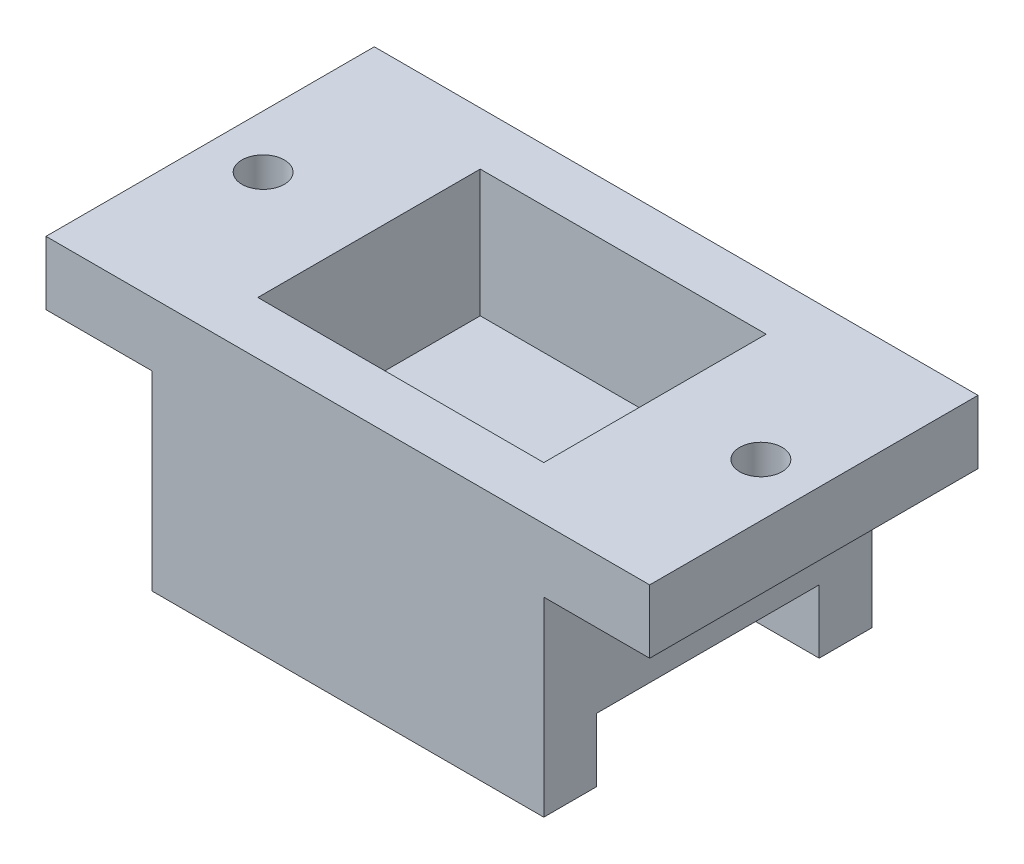
ISO-10303-21;
HEADER;
FILE_DESCRIPTION(('STEP AP214'),'2;1');
FILE_NAME('part.step','',(''),(''),'','','');
FILE_SCHEMA(('AUTOMOTIVE_DESIGN { 1 0 10303 214 1 1 1 1 }'));
ENDSEC;
DATA;
#1=APPLICATION_CONTEXT('core data for automotive mechanical design processes');
#2=APPLICATION_PROTOCOL_DEFINITION('international standard','automotive_design',2000,#1);
#3=PRODUCT_CONTEXT('',#1,'mechanical');
#4=PRODUCT('Part','Part','',(#3));
#5=PRODUCT_RELATED_PRODUCT_CATEGORY('part','',(#4));
#6=PRODUCT_DEFINITION_FORMATION('','',#4);
#7=PRODUCT_DEFINITION_CONTEXT('part definition',#1,'design');
#8=PRODUCT_DEFINITION('design','',#6,#7);
#9=PRODUCT_DEFINITION_SHAPE('','',#8);
#10=(LENGTH_UNIT() NAMED_UNIT(*) SI_UNIT(.MILLI.,.METRE.));
#11=(NAMED_UNIT(*) PLANE_ANGLE_UNIT() SI_UNIT($,.RADIAN.));
#12=(NAMED_UNIT(*) SI_UNIT($,.STERADIAN.) SOLID_ANGLE_UNIT());
#13=UNCERTAINTY_MEASURE_WITH_UNIT(LENGTH_MEASURE(1.E-05),#10,'distance_accuracy_value','');
#14=(GEOMETRIC_REPRESENTATION_CONTEXT(3) GLOBAL_UNCERTAINTY_ASSIGNED_CONTEXT((#13)) GLOBAL_UNIT_ASSIGNED_CONTEXT((#10,
#11,#12)) REPRESENTATION_CONTEXT('',''));
#15=CARTESIAN_POINT('',(0.,0.,0.));
#16=DIRECTION('',(0.,0.,1.));
#17=DIRECTION('',(1.,0.,0.));
#18=AXIS2_PLACEMENT_3D('',#15,#16,#17);
#19=CARTESIAN_POINT('',(-12.8729166666667,11.,-6.78333333333334));
#20=DIRECTION('',(1.,0.,0.));
#21=DIRECTION('',(0.,0.,-1.));
#22=AXIS2_PLACEMENT_3D('',#19,#20,#21);
#23=PLANE('',#22);
#24=DIRECTION('',(0.,0.,1.));
#25=VECTOR('',#24,1.);
#26=CARTESIAN_POINT('',(-12.8729166666667,11.,-6.78333333333334));
#27=LINE('',#26,#25);
#28=CARTESIAN_POINT('',(-12.8729166666667,11.,-6.78333333333334));
#29=VERTEX_POINT('',#28);
#30=CARTESIAN_POINT('',(-12.8729166666667,11.,8.71666666666666));
#31=VERTEX_POINT('',#30);
#32=EDGE_CURVE('E56',#29,#31,#27,.T.);
#33=ORIENTED_EDGE('',*,*,#32,.F.);
#34=DIRECTION('',(0.,-1.,0.));
#35=VECTOR('',#34,1.);
#36=CARTESIAN_POINT('',(-12.8729166666667,11.,-6.78333333333334));
#37=LINE('',#36,#35);
#38=CARTESIAN_POINT('',(-12.8729166666667,2.,-6.78333333333334));
#39=VERTEX_POINT('',#38);
#40=EDGE_CURVE('E48',#29,#39,#37,.T.);
#41=ORIENTED_EDGE('',*,*,#40,.T.);
#42=DIRECTION('',(0.,0.,-1.));
#43=VECTOR('',#42,1.);
#44=CARTESIAN_POINT('',(-12.8729166666667,2.,0.));
#45=LINE('',#44,#43);
#46=CARTESIAN_POINT('',(-12.8729166666667,2.,-4.28456473604802));
#47=VERTEX_POINT('',#46);
#48=EDGE_CURVE('E207',#47,#39,#45,.T.);
#49=ORIENTED_EDGE('',*,*,#48,.F.);
#50=DIRECTION('',(0.,1.,0.));
#51=VECTOR('',#50,1.);
#52=CARTESIAN_POINT('',(-12.8729166666667,2.,-4.28456473604802));
#53=LINE('',#52,#51);
#54=CARTESIAN_POINT('',(-12.8729166666667,5.,-4.28456473604802));
#55=VERTEX_POINT('',#54);
#56=EDGE_CURVE('E212',#47,#55,#53,.T.);
#57=ORIENTED_EDGE('',*,*,#56,.T.);
#58=DIRECTION('',(0.,0.,1.));
#59=VECTOR('',#58,1.);
#60=CARTESIAN_POINT('',(-12.8729166666667,5.,-17.2833333333333));
#61=LINE('',#60,#59);
#62=CARTESIAN_POINT('',(-12.8729166666667,5.,-4.28333333333334));
#63=VERTEX_POINT('',#62);
#64=EDGE_CURVE('E272',#55,#63,#61,.T.);
#65=ORIENTED_EDGE('',*,*,#64,.T.);
#66=DIRECTION('',(0.,1.,0.));
#67=VECTOR('',#66,1.);
#68=CARTESIAN_POINT('',(-12.8729166666667,2.,-4.28333333333334));
#69=LINE('',#68,#67);
#70=CARTESIAN_POINT('',(-12.8729166666667,2.,-4.28333333333334));
#71=VERTEX_POINT('',#70);
#72=EDGE_CURVE('E245',#71,#63,#69,.T.);
#73=ORIENTED_EDGE('',*,*,#72,.F.);
#74=DIRECTION('',(0.,0.,-1.));
#75=VECTOR('',#74,1.);
#76=CARTESIAN_POINT('',(-12.8729166666667,2.,0.));
#77=LINE('',#76,#75);
#78=CARTESIAN_POINT('',(-12.8729166666667,2.,8.71666666666666));
#79=VERTEX_POINT('',#78);
#80=EDGE_CURVE('E228',#79,#71,#77,.T.);
#81=ORIENTED_EDGE('',*,*,#80,.F.);
#82=DIRECTION('',(0.,-1.,0.));
#83=VECTOR('',#82,1.);
#84=CARTESIAN_POINT('',(-12.8729166666667,11.,8.71666666666666));
#85=LINE('',#84,#83);
#86=EDGE_CURVE('E325',#31,#79,#85,.T.);
#87=ORIENTED_EDGE('',*,*,#86,.F.);
#88=EDGE_LOOP('',(#33,#41,#49,#57,#65,#73,#81,#87));
#89=FACE_BOUND('',#88,.T.);
#90=ADVANCED_FACE('F39',(#89),#23,.F.);
#91=CARTESIAN_POINT('',(-12.8729166666667,5.,-17.2833333333333));
#92=DIRECTION('',(0.,1.,0.));
#93=DIRECTION('',(0.,0.,1.));
#94=AXIS2_PLACEMENT_3D('',#91,#92,#93);
#95=PLANE('',#94);
#96=DIRECTION('',(-1.,0.,0.));
#97=VECTOR('',#96,1.);
#98=CARTESIAN_POINT('',(0.,5.,-4.28456473604802));
#99=LINE('',#98,#97);
#100=CARTESIAN_POINT('',(5.62708333333332,5.,-4.28456473604802));
#101=VERTEX_POINT('',#100);
#102=EDGE_CURVE('E196',#101,#55,#99,.T.);
#103=ORIENTED_EDGE('',*,*,#102,.F.);
#104=DIRECTION('',(0.,0.,1.));
#105=VECTOR('',#104,1.);
#106=CARTESIAN_POINT('',(5.62708333333332,5.,-17.2833333333333));
#107=LINE('',#106,#105);
#108=CARTESIAN_POINT('',(5.62708333333332,5.,6.2178980693814));
#109=VERTEX_POINT('',#108);
#110=EDGE_CURVE('E271',#101,#109,#107,.T.);
#111=ORIENTED_EDGE('',*,*,#110,.T.);
#112=DIRECTION('',(-1.,0.,0.));
#113=VECTOR('',#112,1.);
#114=CARTESIAN_POINT('',(0.,5.,6.2178980693814));
#115=LINE('',#114,#113);
#116=CARTESIAN_POINT('',(0.12708333333332,5.,6.2178980693814));
#117=VERTEX_POINT('',#116);
#118=EDGE_CURVE('E64',#109,#117,#115,.T.);
#119=ORIENTED_EDGE('',*,*,#118,.T.);
#120=DIRECTION('',(0.,0.,-1.));
#121=VECTOR('',#120,1.);
#122=CARTESIAN_POINT('',(0.12708333333332,5.,0.));
#123=LINE('',#122,#121);
#124=CARTESIAN_POINT('',(0.127083333333323,5.,6.21666666666666));
#125=VERTEX_POINT('',#124);
#126=EDGE_CURVE('E222',#117,#125,#123,.T.);
#127=ORIENTED_EDGE('',*,*,#126,.T.);
#128=DIRECTION('',(-1.,0.,0.));
#129=VECTOR('',#128,1.);
#130=CARTESIAN_POINT('',(-10.3729166666667,5.,6.21666666666666));
#131=LINE('',#130,#129);
#132=CARTESIAN_POINT('',(3.12708333333332,5.,6.21666666666666));
#133=VERTEX_POINT('',#132);
#134=EDGE_CURVE('E274',#133,#125,#131,.T.);
#135=ORIENTED_EDGE('',*,*,#134,.F.);
#136=DIRECTION('',(0.,0.,1.));
#137=VECTOR('',#136,1.);
#138=CARTESIAN_POINT('',(3.12708333333332,5.,-4.28333333333334));
#139=LINE('',#138,#137);
#140=CARTESIAN_POINT('',(3.12708333333332,5.,-4.28333333333334));
#141=VERTEX_POINT('',#140);
#142=EDGE_CURVE('E278',#141,#133,#139,.T.);
#143=ORIENTED_EDGE('',*,*,#142,.F.);
#144=DIRECTION('',(1.,0.,0.));
#145=VECTOR('',#144,1.);
#146=CARTESIAN_POINT('',(-10.3729166666667,5.,-4.28333333333334));
#147=LINE('',#146,#145);
#148=CARTESIAN_POINT('',(0.127083333333319,5.,-4.28333333333334));
#149=VERTEX_POINT('',#148);
#150=EDGE_CURVE('E281',#149,#141,#147,.T.);
#151=ORIENTED_EDGE('',*,*,#150,.F.);
#152=DIRECTION('',(1.,0.,0.));
#153=VECTOR('',#152,1.);
#154=CARTESIAN_POINT('',(0.,5.,-4.28333333333334));
#155=LINE('',#154,#153);
#156=EDGE_CURVE('E237',#63,#149,#155,.T.);
#157=ORIENTED_EDGE('',*,*,#156,.F.);
#158=ORIENTED_EDGE('',*,*,#64,.F.);
#159=EDGE_LOOP('',(#103,#111,#119,#127,#135,#143,#151,#157,#158));
#160=FACE_BOUND('',#159,.T.);
#161=ADVANCED_FACE('F365',(#160),#95,.F.);
#162=CARTESIAN_POINT('',(5.62708333333332,11.,-6.78333333333334));
#163=DIRECTION('',(-1.,0.,0.));
#164=DIRECTION('',(0.,0.,1.));
#165=AXIS2_PLACEMENT_3D('',#162,#163,#164);
#166=PLANE('',#165);
#167=DIRECTION('',(0.,0.,-1.));
#168=VECTOR('',#167,1.);
#169=CARTESIAN_POINT('',(5.62708333333332,11.,8.71666666666666));
#170=LINE('',#169,#168);
#171=CARTESIAN_POINT('',(5.62708333333332,11.,8.71666666666666));
#172=VERTEX_POINT('',#171);
#173=CARTESIAN_POINT('',(5.62708333333332,11.,-6.78333333333334));
#174=VERTEX_POINT('',#173);
#175=EDGE_CURVE('E251',#172,#174,#170,.T.);
#176=ORIENTED_EDGE('',*,*,#175,.F.);
#177=DIRECTION('',(0.,-1.,0.));
#178=VECTOR('',#177,1.);
#179=CARTESIAN_POINT('',(5.62708333333332,11.,8.71666666666666));
#180=LINE('',#179,#178);
#181=CARTESIAN_POINT('',(5.62708333333332,2.,8.71666666666666));
#182=VERTEX_POINT('',#181);
#183=EDGE_CURVE('E323',#172,#182,#180,.T.);
#184=ORIENTED_EDGE('',*,*,#183,.T.);
#185=DIRECTION('',(0.,0.,1.));
#186=VECTOR('',#185,1.);
#187=CARTESIAN_POINT('',(5.62708333333332,2.,0.));
#188=LINE('',#187,#186);
#189=CARTESIAN_POINT('',(5.62708333333332,2.,6.2178980693814));
#190=VERTEX_POINT('',#189);
#191=EDGE_CURVE('E221',#190,#182,#188,.T.);
#192=ORIENTED_EDGE('',*,*,#191,.F.);
#193=DIRECTION('',(0.,1.,0.));
#194=VECTOR('',#193,1.);
#195=CARTESIAN_POINT('',(5.62708333333332,2.,6.2178980693814));
#196=LINE('',#195,#194);
#197=EDGE_CURVE('E248',#190,#109,#196,.T.);
#198=ORIENTED_EDGE('',*,*,#197,.T.);
#199=ORIENTED_EDGE('',*,*,#110,.F.);
#200=DIRECTION('',(0.,1.,0.));
#201=VECTOR('',#200,1.);
#202=CARTESIAN_POINT('',(5.62708333333332,2.,-4.28456473604802));
#203=LINE('',#202,#201);
#204=CARTESIAN_POINT('',(5.62708333333332,2.,-4.28456473604802));
#205=VERTEX_POINT('',#204);
#206=EDGE_CURVE('E216',#205,#101,#203,.T.);
#207=ORIENTED_EDGE('',*,*,#206,.F.);
#208=DIRECTION('',(0.,0.,1.));
#209=VECTOR('',#208,1.);
#210=CARTESIAN_POINT('',(5.62708333333332,2.,0.));
#211=LINE('',#210,#209);
#212=CARTESIAN_POINT('',(5.62708333333332,2.,-6.78333333333334));
#213=VERTEX_POINT('',#212);
#214=EDGE_CURVE('E198',#213,#205,#211,.T.);
#215=ORIENTED_EDGE('',*,*,#214,.F.);
#216=DIRECTION('',(0.,-1.,0.));
#217=VECTOR('',#216,1.);
#218=CARTESIAN_POINT('',(5.62708333333332,11.,-6.78333333333334));
#219=LINE('',#218,#217);
#220=EDGE_CURVE('E11',#174,#213,#219,.T.);
#221=ORIENTED_EDGE('',*,*,#220,.F.);
#222=EDGE_LOOP('',(#176,#184,#192,#198,#199,#207,#215,#221));
#223=FACE_BOUND('',#222,.T.);
#224=ADVANCED_FACE('F41',(#223),#166,.F.);
#225=CARTESIAN_POINT('',(-12.8729166666667,11.,-6.78333333333334));
#226=DIRECTION('',(0.,0.,1.));
#227=DIRECTION('',(1.,0.,0.));
#228=AXIS2_PLACEMENT_3D('',#225,#226,#227);
#229=PLANE('',#228);
#230=DIRECTION('',(-1.,0.,0.));
#231=VECTOR('',#230,1.);
#232=CARTESIAN_POINT('',(-12.8729166666667,14.,-6.78333333333334));
#233=LINE('',#232,#231);
#234=CARTESIAN_POINT('',(10.6270833333333,14.,-6.78333333333334));
#235=VERTEX_POINT('',#234);
#236=CARTESIAN_POINT('',(-17.8729166666667,14.,-6.78333333333334));
#237=VERTEX_POINT('',#236);
#238=EDGE_CURVE('E321',#235,#237,#233,.T.);
#239=ORIENTED_EDGE('',*,*,#238,.F.);
#240=DIRECTION('',(0.,1.,0.));
#241=VECTOR('',#240,1.);
#242=CARTESIAN_POINT('',(10.6270833333333,14.,-6.78333333333334));
#243=LINE('',#242,#241);
#244=CARTESIAN_POINT('',(10.6270833333333,11.,-6.78333333333334));
#245=VERTEX_POINT('',#244);
#246=EDGE_CURVE('E257',#245,#235,#243,.T.);
#247=ORIENTED_EDGE('',*,*,#246,.F.);
#248=DIRECTION('',(-1.,0.,0.));
#249=VECTOR('',#248,1.);
#250=CARTESIAN_POINT('',(10.6270833333333,11.,-6.78333333333334));
#251=LINE('',#250,#249);
#252=EDGE_CURVE('E263',#245,#174,#251,.T.);
#253=ORIENTED_EDGE('',*,*,#252,.T.);
#254=ORIENTED_EDGE('',*,*,#220,.T.);
#255=DIRECTION('',(1.,0.,0.));
#256=VECTOR('',#255,1.);
#257=CARTESIAN_POINT('',(0.,2.,-6.78333333333334));
#258=LINE('',#257,#256);
#259=EDGE_CURVE('E210',#39,#213,#258,.T.);
#260=ORIENTED_EDGE('',*,*,#259,.F.);
#261=ORIENTED_EDGE('',*,*,#40,.F.);
#262=DIRECTION('',(1.,0.,0.));
#263=VECTOR('',#262,1.);
#264=CARTESIAN_POINT('',(-17.8729166666667,11.,-6.78333333333334));
#265=LINE('',#264,#263);
#266=CARTESIAN_POINT('',(-17.8729166666667,11.,-6.78333333333334));
#267=VERTEX_POINT('',#266);
#268=EDGE_CURVE('E178',#267,#29,#265,.T.);
#269=ORIENTED_EDGE('',*,*,#268,.F.);
#270=DIRECTION('',(0.,-1.,0.));
#271=VECTOR('',#270,1.);
#272=CARTESIAN_POINT('',(-17.8729166666667,14.,-6.78333333333334));
#273=LINE('',#272,#271);
#274=EDGE_CURVE('E185',#237,#267,#273,.T.);
#275=ORIENTED_EDGE('',*,*,#274,.F.);
#276=EDGE_LOOP('',(#239,#247,#253,#254,#260,#261,#269,#275));
#277=FACE_BOUND('',#276,.T.);
#278=ADVANCED_FACE('F194',(#277),#229,.F.);
#279=CARTESIAN_POINT('',(-12.8729166666667,11.,8.71666666666666));
#280=DIRECTION('',(0.,0.,-1.));
#281=DIRECTION('',(-1.,0.,0.));
#282=AXIS2_PLACEMENT_3D('',#279,#280,#281);
#283=PLANE('',#282);
#284=DIRECTION('',(1.,0.,0.));
#285=VECTOR('',#284,1.);
#286=CARTESIAN_POINT('',(-12.8729166666667,14.,8.71666666666666));
#287=LINE('',#286,#285);
#288=CARTESIAN_POINT('',(-17.8729166666667,14.,8.71666666666666));
#289=VERTEX_POINT('',#288);
#290=CARTESIAN_POINT('',(10.6270833333333,14.,8.71666666666666));
#291=VERTEX_POINT('',#290);
#292=EDGE_CURVE('E313',#289,#291,#287,.T.);
#293=ORIENTED_EDGE('',*,*,#292,.F.);
#294=DIRECTION('',(0.,-1.,0.));
#295=VECTOR('',#294,1.);
#296=CARTESIAN_POINT('',(-17.8729166666667,14.,8.71666666666666));
#297=LINE('',#296,#295);
#298=CARTESIAN_POINT('',(-17.8729166666667,11.,8.71666666666666));
#299=VERTEX_POINT('',#298);
#300=EDGE_CURVE('E184',#289,#299,#297,.T.);
#301=ORIENTED_EDGE('',*,*,#300,.T.);
#302=DIRECTION('',(1.,0.,0.));
#303=VECTOR('',#302,1.);
#304=CARTESIAN_POINT('',(-17.8729166666667,11.,8.71666666666666));
#305=LINE('',#304,#303);
#306=EDGE_CURVE('E180',#299,#31,#305,.T.);
#307=ORIENTED_EDGE('',*,*,#306,.T.);
#308=ORIENTED_EDGE('',*,*,#86,.T.);
#309=DIRECTION('',(-1.,0.,0.));
#310=VECTOR('',#309,1.);
#311=CARTESIAN_POINT('',(0.,2.,8.71666666666666));
#312=LINE('',#311,#310);
#313=EDGE_CURVE('E225',#182,#79,#312,.T.);
#314=ORIENTED_EDGE('',*,*,#313,.F.);
#315=ORIENTED_EDGE('',*,*,#183,.F.);
#316=DIRECTION('',(-1.,0.,0.));
#317=VECTOR('',#316,1.);
#318=CARTESIAN_POINT('',(10.6270833333333,11.,8.71666666666666));
#319=LINE('',#318,#317);
#320=CARTESIAN_POINT('',(10.6270833333333,11.,8.71666666666666));
#321=VERTEX_POINT('',#320);
#322=EDGE_CURVE('E268',#321,#172,#319,.T.);
#323=ORIENTED_EDGE('',*,*,#322,.F.);
#324=DIRECTION('',(0.,-1.,0.));
#325=VECTOR('',#324,1.);
#326=CARTESIAN_POINT('',(10.6270833333333,14.,8.71666666666666));
#327=LINE('',#326,#325);
#328=EDGE_CURVE('E252',#291,#321,#327,.T.);
#329=ORIENTED_EDGE('',*,*,#328,.F.);
#330=EDGE_LOOP('',(#293,#301,#307,#308,#314,#315,#323,#329));
#331=FACE_BOUND('',#330,.T.);
#332=ADVANCED_FACE('F382',(#331),#283,.F.);
#333=CARTESIAN_POINT('',(0.,14.,0.));
#334=DIRECTION('',(0.,1.,0.));
#335=DIRECTION('',(0.,0.,1.));
#336=AXIS2_PLACEMENT_3D('',#333,#334,#335);
#337=PLANE('',#336);
#338=CARTESIAN_POINT('',(-15.3729166666667,14.,0.966666666666656));
#339=DIRECTION('',(0.,1.,0.));
#340=DIRECTION('',(0.,0.,1.));
#341=AXIS2_PLACEMENT_3D('',#338,#339,#340);
#342=CIRCLE('',#341,1.);
#343=CARTESIAN_POINT('',(-15.3729166666667,14.,1.96666666666666));
#344=VERTEX_POINT('',#343);
#345=EDGE_CURVE('E329',#344,#344,#342,.T.);
#346=ORIENTED_EDGE('',*,*,#345,.F.);
#347=EDGE_LOOP('',(#346));
#348=FACE_BOUND('',#347,.T.);
#349=CARTESIAN_POINT('',(8.12708333333332,14.,0.966666666666656));
#350=DIRECTION('',(0.,1.,0.));
#351=DIRECTION('',(0.,0.,1.));
#352=AXIS2_PLACEMENT_3D('',#349,#350,#351);
#353=CIRCLE('',#352,1.);
#354=CARTESIAN_POINT('',(8.12708333333332,14.,1.96666666666666));
#355=VERTEX_POINT('',#354);
#356=EDGE_CURVE('E334',#355,#355,#353,.T.);
#357=ORIENTED_EDGE('',*,*,#356,.F.);
#358=EDGE_LOOP('',(#357));
#359=FACE_BOUND('',#358,.T.);
#360=DIRECTION('',(0.,0.,1.));
#361=VECTOR('',#360,1.);
#362=CARTESIAN_POINT('',(-10.3729166666667,14.,-4.28333333333334));
#363=LINE('',#362,#361);
#364=CARTESIAN_POINT('',(-10.3729166666667,14.,-4.28333333333334));
#365=VERTEX_POINT('',#364);
#366=CARTESIAN_POINT('',(-10.3729166666667,14.,6.21666666666666));
#367=VERTEX_POINT('',#366);
#368=EDGE_CURVE('E290',#365,#367,#363,.T.);
#369=ORIENTED_EDGE('',*,*,#368,.F.);
#370=DIRECTION('',(-1.,0.,0.));
#371=VECTOR('',#370,1.);
#372=CARTESIAN_POINT('',(-10.3729166666667,14.,-4.28333333333334));
#373=LINE('',#372,#371);
#374=CARTESIAN_POINT('',(3.12708333333332,14.,-4.28333333333334));
#375=VERTEX_POINT('',#374);
#376=EDGE_CURVE('E296',#375,#365,#373,.T.);
#377=ORIENTED_EDGE('',*,*,#376,.F.);
#378=DIRECTION('',(0.,0.,-1.));
#379=VECTOR('',#378,1.);
#380=CARTESIAN_POINT('',(3.12708333333332,14.,-4.28333333333334));
#381=LINE('',#380,#379);
#382=CARTESIAN_POINT('',(3.12708333333332,14.,6.21666666666666));
#383=VERTEX_POINT('',#382);
#384=EDGE_CURVE('E306',#383,#375,#381,.T.);
#385=ORIENTED_EDGE('',*,*,#384,.F.);
#386=DIRECTION('',(1.,0.,0.));
#387=VECTOR('',#386,1.);
#388=CARTESIAN_POINT('',(-10.3729166666667,14.,6.21666666666666));
#389=LINE('',#388,#387);
#390=EDGE_CURVE('E303',#367,#383,#389,.T.);
#391=ORIENTED_EDGE('',*,*,#390,.F.);
#392=EDGE_LOOP('',(#369,#377,#385,#391));
#393=FACE_BOUND('',#392,.T.);
#394=ORIENTED_EDGE('',*,*,#238,.T.);
#395=DIRECTION('',(0.,0.,1.));
#396=VECTOR('',#395,1.);
#397=CARTESIAN_POINT('',(-17.8729166666667,14.,-6.78333333333334));
#398=LINE('',#397,#396);
#399=EDGE_CURVE('E191',#237,#289,#398,.T.);
#400=ORIENTED_EDGE('',*,*,#399,.T.);
#401=ORIENTED_EDGE('',*,*,#292,.T.);
#402=DIRECTION('',(0.,0.,1.));
#403=VECTOR('',#402,1.);
#404=CARTESIAN_POINT('',(10.6270833333333,14.,8.71666666666666));
#405=LINE('',#404,#403);
#406=EDGE_CURVE('E260',#235,#291,#405,.T.);
#407=ORIENTED_EDGE('',*,*,#406,.F.);
#408=EDGE_LOOP('',(#394,#400,#401,#407));
#409=FACE_BOUND('',#408,.T.);
#410=ADVANCED_FACE('F343',(#348,#359,#393,#409),#337,.T.);
#411=CARTESIAN_POINT('',(-10.3729166666667,8.,-4.28333333333334));
#412=DIRECTION('',(-1.,0.,0.));
#413=DIRECTION('',(0.,0.,1.));
#414=AXIS2_PLACEMENT_3D('',#411,#412,#413);
#415=PLANE('',#414);
#416=ORIENTED_EDGE('',*,*,#368,.T.);
#417=DIRECTION('',(0.,1.,0.));
#418=VECTOR('',#417,1.);
#419=CARTESIAN_POINT('',(-10.3729166666667,8.,6.21666666666666));
#420=LINE('',#419,#418);
#421=CARTESIAN_POINT('',(-10.3729166666667,8.,6.21666666666666));
#422=VERTEX_POINT('',#421);
#423=EDGE_CURVE('E301',#422,#367,#420,.T.);
#424=ORIENTED_EDGE('',*,*,#423,.F.);
#425=DIRECTION('',(0.,0.,1.));
#426=VECTOR('',#425,1.);
#427=CARTESIAN_POINT('',(-10.3729166666667,8.,-4.28333333333334));
#428=LINE('',#427,#426);
#429=CARTESIAN_POINT('',(-10.3729166666667,8.,-4.28333333333334));
#430=VERTEX_POINT('',#429);
#431=EDGE_CURVE('E292',#430,#422,#428,.T.);
#432=ORIENTED_EDGE('',*,*,#431,.F.);
#433=DIRECTION('',(0.,1.,0.));
#434=VECTOR('',#433,1.);
#435=CARTESIAN_POINT('',(-10.3729166666667,8.,-4.28333333333334));
#436=LINE('',#435,#434);
#437=EDGE_CURVE('E311',#430,#365,#436,.T.);
#438=ORIENTED_EDGE('',*,*,#437,.T.);
#439=EDGE_LOOP('',(#416,#424,#432,#438));
#440=FACE_BOUND('',#439,.T.);
#441=ADVANCED_FACE('F410',(#440),#415,.F.);
#442=CARTESIAN_POINT('',(-10.3729166666667,8.,-4.28333333333334));
#443=DIRECTION('',(0.,0.,-1.));
#444=DIRECTION('',(-1.,0.,0.));
#445=AXIS2_PLACEMENT_3D('',#442,#443,#444);
#446=PLANE('',#445);
#447=DIRECTION('',(0.,1.,0.));
#448=VECTOR('',#447,1.);
#449=CARTESIAN_POINT('',(0.12708333333332,-18.,-4.28333333333334));
#450=LINE('',#449,#448);
#451=CARTESIAN_POINT('',(0.127083333333321,8.,-4.28333333333334));
#452=VERTEX_POINT('',#451);
#453=EDGE_CURVE('E287',#149,#452,#450,.T.);
#454=ORIENTED_EDGE('',*,*,#453,.F.);
#455=ORIENTED_EDGE('',*,*,#150,.T.);
#456=DIRECTION('',(0.,1.,0.));
#457=VECTOR('',#456,1.);
#458=CARTESIAN_POINT('',(3.12708333333332,8.,-4.28333333333334));
#459=LINE('',#458,#457);
#460=EDGE_CURVE('E314',#141,#375,#459,.T.);
#461=ORIENTED_EDGE('',*,*,#460,.T.);
#462=ORIENTED_EDGE('',*,*,#376,.T.);
#463=ORIENTED_EDGE('',*,*,#437,.F.);
#464=DIRECTION('',(-1.,0.,0.));
#465=VECTOR('',#464,1.);
#466=CARTESIAN_POINT('',(-10.3729166666667,8.,-4.28333333333334));
#467=LINE('',#466,#465);
#468=EDGE_CURVE('E299',#452,#430,#467,.T.);
#469=ORIENTED_EDGE('',*,*,#468,.F.);
#470=EDGE_LOOP('',(#454,#455,#461,#462,#463,#469));
#471=FACE_BOUND('',#470,.T.);
#472=ADVANCED_FACE('F400',(#471),#446,.F.);
#473=CARTESIAN_POINT('',(3.12708333333332,8.,-4.28333333333334));
#474=DIRECTION('',(1.,0.,0.));
#475=DIRECTION('',(0.,0.,-1.));
#476=AXIS2_PLACEMENT_3D('',#473,#474,#475);
#477=PLANE('',#476);
#478=ORIENTED_EDGE('',*,*,#460,.F.);
#479=ORIENTED_EDGE('',*,*,#142,.T.);
#480=DIRECTION('',(0.,1.,0.));
#481=VECTOR('',#480,1.);
#482=CARTESIAN_POINT('',(3.12708333333332,8.,6.21666666666666));
#483=LINE('',#482,#481);
#484=EDGE_CURVE('E316',#133,#383,#483,.T.);
#485=ORIENTED_EDGE('',*,*,#484,.T.);
#486=ORIENTED_EDGE('',*,*,#384,.T.);
#487=EDGE_LOOP('',(#478,#479,#485,#486));
#488=FACE_BOUND('',#487,.T.);
#489=ADVANCED_FACE('F397',(#488),#477,.F.);
#490=CARTESIAN_POINT('',(-10.3729166666667,8.,6.21666666666666));
#491=DIRECTION('',(0.,0.,1.));
#492=DIRECTION('',(1.,0.,0.));
#493=AXIS2_PLACEMENT_3D('',#490,#491,#492);
#494=PLANE('',#493);
#495=ORIENTED_EDGE('',*,*,#484,.F.);
#496=ORIENTED_EDGE('',*,*,#134,.T.);
#497=DIRECTION('',(0.,1.,0.));
#498=VECTOR('',#497,1.);
#499=CARTESIAN_POINT('',(0.127083333333323,-18.,6.21666666666666));
#500=LINE('',#499,#498);
#501=CARTESIAN_POINT('',(0.127083333333323,8.,6.21666666666666));
#502=VERTEX_POINT('',#501);
#503=EDGE_CURVE('E288',#125,#502,#500,.T.);
#504=ORIENTED_EDGE('',*,*,#503,.T.);
#505=DIRECTION('',(1.,0.,0.));
#506=VECTOR('',#505,1.);
#507=CARTESIAN_POINT('',(-10.3729166666667,8.,6.21666666666666));
#508=LINE('',#507,#506);
#509=EDGE_CURVE('E295',#422,#502,#508,.T.);
#510=ORIENTED_EDGE('',*,*,#509,.F.);
#511=ORIENTED_EDGE('',*,*,#423,.T.);
#512=ORIENTED_EDGE('',*,*,#390,.T.);
#513=EDGE_LOOP('',(#495,#496,#504,#510,#511,#512));
#514=FACE_BOUND('',#513,.T.);
#515=ADVANCED_FACE('F391',(#514),#494,.F.);
#516=CARTESIAN_POINT('',(0.,8.,0.));
#517=DIRECTION('',(0.,1.,0.));
#518=DIRECTION('',(0.,0.,1.));
#519=AXIS2_PLACEMENT_3D('',#516,#517,#518);
#520=PLANE('',#519);
#521=DIRECTION('',(0.,0.,1.));
#522=VECTOR('',#521,1.);
#523=CARTESIAN_POINT('',(0.12708333333332,8.,-4.28333333333334));
#524=LINE('',#523,#522);
#525=EDGE_CURVE('E284',#452,#502,#524,.T.);
#526=ORIENTED_EDGE('',*,*,#525,.F.);
#527=ORIENTED_EDGE('',*,*,#468,.T.);
#528=ORIENTED_EDGE('',*,*,#431,.T.);
#529=ORIENTED_EDGE('',*,*,#509,.T.);
#530=EDGE_LOOP('',(#526,#527,#528,#529));
#531=FACE_BOUND('',#530,.T.);
#532=ADVANCED_FACE('F405',(#531),#520,.T.);
#533=CARTESIAN_POINT('',(0.12708333333332,-18.,-4.28333333333334));
#534=DIRECTION('',(-1.,0.,0.));
#535=DIRECTION('',(0.,0.,1.));
#536=AXIS2_PLACEMENT_3D('',#533,#534,#535);
#537=PLANE('',#536);
#538=ORIENTED_EDGE('',*,*,#503,.F.);
#539=ORIENTED_EDGE('',*,*,#126,.F.);
#540=DIRECTION('',(0.,1.,0.));
#541=VECTOR('',#540,1.);
#542=CARTESIAN_POINT('',(0.12708333333332,2.,6.2178980693814));
#543=LINE('',#542,#541);
#544=CARTESIAN_POINT('',(0.12708333333332,2.,6.2178980693814));
#545=VERTEX_POINT('',#544);
#546=EDGE_CURVE('E235',#545,#117,#543,.T.);
#547=ORIENTED_EDGE('',*,*,#546,.F.);
#548=DIRECTION('',(0.,0.,-1.));
#549=VECTOR('',#548,1.);
#550=CARTESIAN_POINT('',(0.12708333333332,2.,0.));
#551=LINE('',#550,#549);
#552=CARTESIAN_POINT('',(0.127083333333319,2.,-4.28333333333334));
#553=VERTEX_POINT('',#552);
#554=EDGE_CURVE('E232',#545,#553,#551,.T.);
#555=ORIENTED_EDGE('',*,*,#554,.T.);
#556=DIRECTION('',(0.,1.,0.));
#557=VECTOR('',#556,1.);
#558=CARTESIAN_POINT('',(0.127083333333319,2.,-4.28333333333334));
#559=LINE('',#558,#557);
#560=EDGE_CURVE('E242',#553,#149,#559,.T.);
#561=ORIENTED_EDGE('',*,*,#560,.T.);
#562=ORIENTED_EDGE('',*,*,#453,.T.);
#563=ORIENTED_EDGE('',*,*,#525,.T.);
#564=EDGE_LOOP('',(#538,#539,#547,#555,#561,#562,#563));
#565=FACE_BOUND('',#564,.T.);
#566=ADVANCED_FACE('F388',(#565),#537,.F.);
#567=CARTESIAN_POINT('',(10.6270833333333,11.,8.71666666666666));
#568=DIRECTION('',(0.,1.,0.));
#569=DIRECTION('',(0.,0.,1.));
#570=AXIS2_PLACEMENT_3D('',#567,#568,#569);
#571=PLANE('',#570);
#572=CARTESIAN_POINT('',(8.12708333333332,11.,0.966666666666656));
#573=DIRECTION('',(0.,1.,0.));
#574=DIRECTION('',(0.,0.,1.));
#575=AXIS2_PLACEMENT_3D('',#572,#573,#574);
#576=CIRCLE('',#575,1.);
#577=CARTESIAN_POINT('',(8.12708333333332,11.,1.96666666666666));
#578=VERTEX_POINT('',#577);
#579=EDGE_CURVE('E43',#578,#578,#576,.T.);
#580=ORIENTED_EDGE('',*,*,#579,.T.);
#581=EDGE_LOOP('',(#580));
#582=FACE_BOUND('',#581,.T.);
#583=ORIENTED_EDGE('',*,*,#175,.T.);
#584=ORIENTED_EDGE('',*,*,#252,.F.);
#585=DIRECTION('',(0.,0.,-1.));
#586=VECTOR('',#585,1.);
#587=CARTESIAN_POINT('',(10.6270833333333,11.,8.71666666666666));
#588=LINE('',#587,#586);
#589=EDGE_CURVE('E255',#321,#245,#588,.T.);
#590=ORIENTED_EDGE('',*,*,#589,.F.);
#591=ORIENTED_EDGE('',*,*,#322,.T.);
#592=EDGE_LOOP('',(#583,#584,#590,#591));
#593=FACE_BOUND('',#592,.T.);
#594=ADVANCED_FACE('F352',(#582,#593),#571,.F.);
#595=CARTESIAN_POINT('',(10.6270833333333,0.,0.));
#596=DIRECTION('',(1.,0.,0.));
#597=DIRECTION('',(0.,0.,-1.));
#598=AXIS2_PLACEMENT_3D('',#595,#596,#597);
#599=PLANE('',#598);
#600=ORIENTED_EDGE('',*,*,#328,.T.);
#601=ORIENTED_EDGE('',*,*,#589,.T.);
#602=ORIENTED_EDGE('',*,*,#246,.T.);
#603=ORIENTED_EDGE('',*,*,#406,.T.);
#604=EDGE_LOOP('',(#600,#601,#602,#603));
#605=FACE_BOUND('',#604,.T.);
#606=ADVANCED_FACE('F347',(#605),#599,.T.);
#607=CARTESIAN_POINT('',(0.,2.,6.2178980693814));
#608=DIRECTION('',(0.,0.,-1.));
#609=DIRECTION('',(-1.,0.,0.));
#610=AXIS2_PLACEMENT_3D('',#607,#608,#609);
#611=PLANE('',#610);
#612=ORIENTED_EDGE('',*,*,#118,.F.);
#613=ORIENTED_EDGE('',*,*,#197,.F.);
#614=DIRECTION('',(-1.,0.,0.));
#615=VECTOR('',#614,1.);
#616=CARTESIAN_POINT('',(0.,2.,6.2178980693814));
#617=LINE('',#616,#615);
#618=EDGE_CURVE('E218',#190,#545,#617,.T.);
#619=ORIENTED_EDGE('',*,*,#618,.T.);
#620=ORIENTED_EDGE('',*,*,#546,.T.);
#621=EDGE_LOOP('',(#612,#613,#619,#620));
#622=FACE_BOUND('',#621,.T.);
#623=ADVANCED_FACE('F384',(#622),#611,.T.);
#624=CARTESIAN_POINT('',(0.,2.,-4.28333333333334));
#625=DIRECTION('',(0.,0.,1.));
#626=DIRECTION('',(1.,0.,0.));
#627=AXIS2_PLACEMENT_3D('',#624,#625,#626);
#628=PLANE('',#627);
#629=ORIENTED_EDGE('',*,*,#156,.T.);
#630=ORIENTED_EDGE('',*,*,#560,.F.);
#631=DIRECTION('',(1.,0.,0.));
#632=VECTOR('',#631,1.);
#633=CARTESIAN_POINT('',(0.,2.,-4.28333333333334));
#634=LINE('',#633,#632);
#635=EDGE_CURVE('E230',#71,#553,#634,.T.);
#636=ORIENTED_EDGE('',*,*,#635,.F.);
#637=ORIENTED_EDGE('',*,*,#72,.T.);
#638=EDGE_LOOP('',(#629,#630,#636,#637));
#639=FACE_BOUND('',#638,.T.);
#640=ADVANCED_FACE('F373',(#639),#628,.F.);
#641=CARTESIAN_POINT('',(0.,2.,0.));
#642=DIRECTION('',(0.,-1.,0.));
#643=DIRECTION('',(0.,0.,-1.));
#644=AXIS2_PLACEMENT_3D('',#641,#642,#643);
#645=PLANE('',#644);
#646=ORIENTED_EDGE('',*,*,#618,.F.);
#647=ORIENTED_EDGE('',*,*,#191,.T.);
#648=ORIENTED_EDGE('',*,*,#313,.T.);
#649=ORIENTED_EDGE('',*,*,#80,.T.);
#650=ORIENTED_EDGE('',*,*,#635,.T.);
#651=ORIENTED_EDGE('',*,*,#554,.F.);
#652=EDGE_LOOP('',(#646,#647,#648,#649,#650,#651));
#653=FACE_BOUND('',#652,.T.);
#654=ADVANCED_FACE('F377',(#653),#645,.T.);
#655=CARTESIAN_POINT('',(0.,2.,-4.28456473604802));
#656=DIRECTION('',(0.,0.,-1.));
#657=DIRECTION('',(-1.,0.,0.));
#658=AXIS2_PLACEMENT_3D('',#655,#656,#657);
#659=PLANE('',#658);
#660=ORIENTED_EDGE('',*,*,#102,.T.);
#661=ORIENTED_EDGE('',*,*,#56,.F.);
#662=DIRECTION('',(-1.,0.,0.));
#663=VECTOR('',#662,1.);
#664=CARTESIAN_POINT('',(0.,2.,-4.28456473604802));
#665=LINE('',#664,#663);
#666=EDGE_CURVE('E205',#205,#47,#665,.T.);
#667=ORIENTED_EDGE('',*,*,#666,.F.);
#668=ORIENTED_EDGE('',*,*,#206,.T.);
#669=EDGE_LOOP('',(#660,#661,#667,#668));
#670=FACE_BOUND('',#669,.T.);
#671=ADVANCED_FACE('F362',(#670),#659,.F.);
#672=CARTESIAN_POINT('',(0.,2.,0.));
#673=DIRECTION('',(0.,-1.,0.));
#674=DIRECTION('',(0.,0.,-1.));
#675=AXIS2_PLACEMENT_3D('',#672,#673,#674);
#676=PLANE('',#675);
#677=ORIENTED_EDGE('',*,*,#214,.T.);
#678=ORIENTED_EDGE('',*,*,#666,.T.);
#679=ORIENTED_EDGE('',*,*,#48,.T.);
#680=ORIENTED_EDGE('',*,*,#259,.T.);
#681=EDGE_LOOP('',(#677,#678,#679,#680));
#682=FACE_BOUND('',#681,.T.);
#683=ADVANCED_FACE('F356',(#682),#676,.T.);
#684=CARTESIAN_POINT('',(-17.8729166666667,11.,-6.78333333333334));
#685=DIRECTION('',(0.,1.,0.));
#686=DIRECTION('',(0.,0.,1.));
#687=AXIS2_PLACEMENT_3D('',#684,#685,#686);
#688=PLANE('',#687);
#689=CARTESIAN_POINT('',(-15.3729166666667,11.,0.966666666666656));
#690=DIRECTION('',(0.,1.,0.));
#691=DIRECTION('',(0.,0.,1.));
#692=AXIS2_PLACEMENT_3D('',#689,#690,#691);
#693=CIRCLE('',#692,1.);
#694=CARTESIAN_POINT('',(-15.3729166666667,11.,1.96666666666666));
#695=VERTEX_POINT('',#694);
#696=EDGE_CURVE('E327',#695,#695,#693,.T.);
#697=ORIENTED_EDGE('',*,*,#696,.T.);
#698=EDGE_LOOP('',(#697));
#699=FACE_BOUND('',#698,.T.);
#700=ORIENTED_EDGE('',*,*,#32,.T.);
#701=ORIENTED_EDGE('',*,*,#306,.F.);
#702=DIRECTION('',(0.,0.,1.));
#703=VECTOR('',#702,1.);
#704=CARTESIAN_POINT('',(-17.8729166666667,11.,-6.78333333333334));
#705=LINE('',#704,#703);
#706=EDGE_CURVE('E174',#267,#299,#705,.T.);
#707=ORIENTED_EDGE('',*,*,#706,.F.);
#708=ORIENTED_EDGE('',*,*,#268,.T.);
#709=EDGE_LOOP('',(#700,#701,#707,#708));
#710=FACE_BOUND('',#709,.T.);
#711=ADVANCED_FACE('F176',(#699,#710),#688,.F.);
#712=CARTESIAN_POINT('',(-17.8729166666667,0.,0.));
#713=DIRECTION('',(-1.,0.,0.));
#714=DIRECTION('',(0.,0.,1.));
#715=AXIS2_PLACEMENT_3D('',#712,#713,#714);
#716=PLANE('',#715);
#717=ORIENTED_EDGE('',*,*,#274,.T.);
#718=ORIENTED_EDGE('',*,*,#706,.T.);
#719=ORIENTED_EDGE('',*,*,#300,.F.);
#720=ORIENTED_EDGE('',*,*,#399,.F.);
#721=EDGE_LOOP('',(#717,#718,#719,#720));
#722=FACE_BOUND('',#721,.T.);
#723=ADVANCED_FACE('F189',(#722),#716,.T.);
#724=CARTESIAN_POINT('',(-15.3729166666667,9.,0.966666666666656));
#725=DIRECTION('',(0.,1.,0.));
#726=DIRECTION('',(0.,0.,1.));
#727=AXIS2_PLACEMENT_3D('',#724,#725,#726);
#728=CYLINDRICAL_SURFACE('',#727,1.);
#729=ORIENTED_EDGE('',*,*,#345,.T.);
#730=EDGE_LOOP('',(#729));
#731=FACE_BOUND('',#730,.T.);
#732=ORIENTED_EDGE('',*,*,#696,.F.);
#733=EDGE_LOOP('',(#732));
#734=FACE_BOUND('',#733,.T.);
#735=ADVANCED_FACE('F585',(#731,#734),#728,.F.);
#736=CARTESIAN_POINT('',(8.12708333333332,9.,0.966666666666656));
#737=DIRECTION('',(0.,1.,0.));
#738=DIRECTION('',(0.,0.,1.));
#739=AXIS2_PLACEMENT_3D('',#736,#737,#738);
#740=CYLINDRICAL_SURFACE('',#739,1.);
#741=ORIENTED_EDGE('',*,*,#356,.T.);
#742=EDGE_LOOP('',(#741));
#743=FACE_BOUND('',#742,.T.);
#744=ORIENTED_EDGE('',*,*,#579,.F.);
#745=EDGE_LOOP('',(#744));
#746=FACE_BOUND('',#745,.T.);
#747=ADVANCED_FACE('F590',(#743,#746),#740,.F.);
#748=CLOSED_SHELL('',(#90,#161,#224,#278,#332,#410,#441,#472,#489,#515,#532,#566,#594,#606,#623,
#640,#654,#671,#683,#711,#723,#735,#747));
#749=MANIFOLD_SOLID_BREP('B2',#748);
#750=ADVANCED_BREP_SHAPE_REPRESENTATION('',(#18,#749),#14);
#751=SHAPE_DEFINITION_REPRESENTATION(#9,#750);
ENDSEC;
END-ISO-10303-21;
